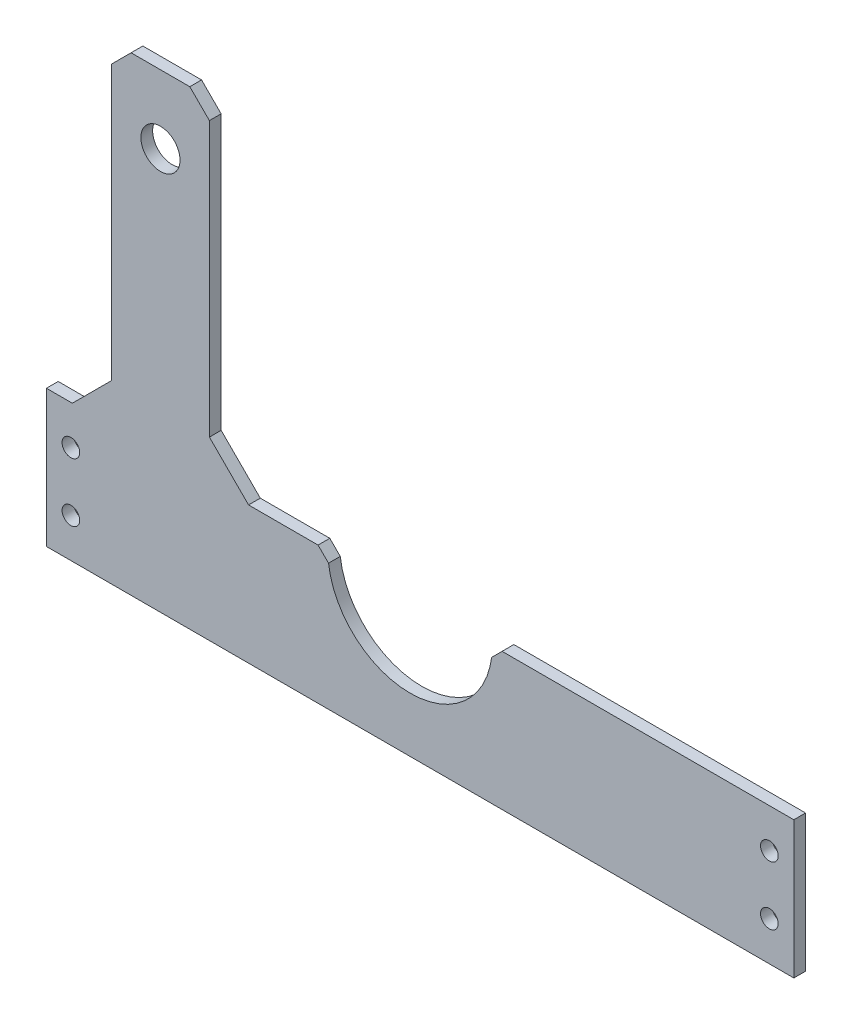
ISO-10303-21;
HEADER;
FILE_DESCRIPTION(('STEP AP214'),'2;1');
FILE_NAME('part.step','',(''),(''),'','','');
FILE_SCHEMA(('AUTOMOTIVE_DESIGN { 1 0 10303 214 1 1 1 1 }'));
ENDSEC;
DATA;
#1=APPLICATION_CONTEXT('core data for automotive mechanical design processes');
#2=APPLICATION_PROTOCOL_DEFINITION('international standard','automotive_design',2000,#1);
#3=PRODUCT_CONTEXT('',#1,'mechanical');
#4=PRODUCT('Part','Part','',(#3));
#5=PRODUCT_RELATED_PRODUCT_CATEGORY('part','',(#4));
#6=PRODUCT_DEFINITION_FORMATION('','',#4);
#7=PRODUCT_DEFINITION_CONTEXT('part definition',#1,'design');
#8=PRODUCT_DEFINITION('design','',#6,#7);
#9=PRODUCT_DEFINITION_SHAPE('','',#8);
#10=(LENGTH_UNIT() NAMED_UNIT(*) SI_UNIT(.MILLI.,.METRE.));
#11=(NAMED_UNIT(*) PLANE_ANGLE_UNIT() SI_UNIT($,.RADIAN.));
#12=(NAMED_UNIT(*) SI_UNIT($,.STERADIAN.) SOLID_ANGLE_UNIT());
#13=UNCERTAINTY_MEASURE_WITH_UNIT(LENGTH_MEASURE(1.E-05),#10,'distance_accuracy_value','');
#14=(GEOMETRIC_REPRESENTATION_CONTEXT(3) GLOBAL_UNCERTAINTY_ASSIGNED_CONTEXT((#13)) GLOBAL_UNIT_ASSIGNED_CONTEXT((#10,
#11,#12)) REPRESENTATION_CONTEXT('',''));
#15=CARTESIAN_POINT('',(0.,0.,0.));
#16=DIRECTION('',(0.,0.,1.));
#17=DIRECTION('',(1.,0.,0.));
#18=AXIS2_PLACEMENT_3D('',#15,#16,#17);
#19=CARTESIAN_POINT('',(-95.435,17.5,1.5));
#20=DIRECTION('',(0.,-1.,0.));
#21=DIRECTION('',(0.,0.,-1.));
#22=AXIS2_PLACEMENT_3D('',#19,#20,#21);
#23=PLANE('',#22);
#24=DIRECTION('',(-1.,0.,0.));
#25=VECTOR('',#24,1.);
#26=CARTESIAN_POINT('',(-95.435,17.5,1.5));
#27=LINE('',#26,#25);
#28=CARTESIAN_POINT('',(-26.065,17.5,1.5));
#29=VERTEX_POINT('',#28);
#30=CARTESIAN_POINT('',(-43.815,17.5,1.5));
#31=VERTEX_POINT('',#30);
#32=EDGE_CURVE('E233',#29,#31,#27,.T.);
#33=ORIENTED_EDGE('',*,*,#32,.F.);
#34=DIRECTION('',(0.,0.,-1.));
#35=VECTOR('',#34,1.);
#36=CARTESIAN_POINT('',(-26.065,17.5,1.5));
#37=LINE('',#36,#35);
#38=CARTESIAN_POINT('',(-26.065,17.5,-1.5));
#39=VERTEX_POINT('',#38);
#40=EDGE_CURVE('E220',#29,#39,#37,.T.);
#41=ORIENTED_EDGE('',*,*,#40,.T.);
#42=DIRECTION('',(-1.,0.,0.));
#43=VECTOR('',#42,1.);
#44=CARTESIAN_POINT('',(-95.435,17.5,-1.5));
#45=LINE('',#44,#43);
#46=CARTESIAN_POINT('',(-43.815,17.5,-1.5));
#47=VERTEX_POINT('',#46);
#48=EDGE_CURVE('E249',#39,#47,#45,.T.);
#49=ORIENTED_EDGE('',*,*,#48,.T.);
#50=DIRECTION('',(0.,0.,1.));
#51=VECTOR('',#50,1.);
#52=CARTESIAN_POINT('',(-43.815,17.5,1.5));
#53=LINE('',#52,#51);
#54=EDGE_CURVE('E208',#47,#31,#53,.T.);
#55=ORIENTED_EDGE('',*,*,#54,.T.);
#56=EDGE_LOOP('',(#33,#41,#49,#55));
#57=FACE_BOUND('',#56,.T.);
#58=ADVANCED_FACE('F37',(#57),#23,.F.);
#59=CARTESIAN_POINT('',(-88.815,17.5,1.5));
#60=VERTEX_POINT('',#59);
#61=CARTESIAN_POINT('',(-95.435,17.5,1.5));
#62=VERTEX_POINT('',#61);
#63=EDGE_CURVE('E165',#60,#62,#27,.T.);
#64=ORIENTED_EDGE('',*,*,#63,.F.);
#65=DIRECTION('',(0.,0.,-1.));
#66=VECTOR('',#65,1.);
#67=CARTESIAN_POINT('',(-88.815,17.5,-1.49999999999995));
#68=LINE('',#67,#66);
#69=CARTESIAN_POINT('',(-88.815,17.5,-1.5));
#70=VERTEX_POINT('',#69);
#71=EDGE_CURVE('E203',#60,#70,#68,.T.);
#72=ORIENTED_EDGE('',*,*,#71,.T.);
#73=CARTESIAN_POINT('',(-95.435,17.5,-1.5));
#74=VERTEX_POINT('',#73);
#75=EDGE_CURVE('E261',#70,#74,#45,.T.);
#76=ORIENTED_EDGE('',*,*,#75,.T.);
#77=DIRECTION('',(0.,0.,-1.));
#78=VECTOR('',#77,1.);
#79=CARTESIAN_POINT('',(-95.435,17.5,1.5));
#80=LINE('',#79,#78);
#81=EDGE_CURVE('E272',#62,#74,#80,.T.);
#82=ORIENTED_EDGE('',*,*,#81,.F.);
#83=EDGE_LOOP('',(#64,#72,#76,#82));
#84=FACE_BOUND('',#83,.T.);
#85=ADVANCED_FACE('F356',(#84),#23,.F.);
#86=CARTESIAN_POINT('',(95.435,17.5,-1.5));
#87=VERTEX_POINT('',#86);
#88=CARTESIAN_POINT('',(20.935,17.5,-1.5));
#89=VERTEX_POINT('',#88);
#90=EDGE_CURVE('E169',#87,#89,#45,.T.);
#91=ORIENTED_EDGE('',*,*,#90,.T.);
#92=DIRECTION('',(0.,0.,1.));
#93=VECTOR('',#92,1.);
#94=CARTESIAN_POINT('',(20.935,17.5,1.5));
#95=LINE('',#94,#93);
#96=CARTESIAN_POINT('',(20.935,17.5,1.5));
#97=VERTEX_POINT('',#96);
#98=EDGE_CURVE('E11',#89,#97,#95,.T.);
#99=ORIENTED_EDGE('',*,*,#98,.T.);
#100=CARTESIAN_POINT('',(95.435,17.5,1.5));
#101=VERTEX_POINT('',#100);
#102=EDGE_CURVE('E242',#101,#97,#27,.T.);
#103=ORIENTED_EDGE('',*,*,#102,.F.);
#104=DIRECTION('',(0.,0.,-1.));
#105=VECTOR('',#104,1.);
#106=CARTESIAN_POINT('',(95.435,17.5,1.5));
#107=LINE('',#106,#105);
#108=EDGE_CURVE('E179',#101,#87,#107,.T.);
#109=ORIENTED_EDGE('',*,*,#108,.T.);
#110=EDGE_LOOP('',(#91,#99,#103,#109));
#111=FACE_BOUND('',#110,.T.);
#112=ADVANCED_FACE('F257',(#111),#23,.F.);
#113=CARTESIAN_POINT('',(-95.435,-17.5,1.5));
#114=DIRECTION('',(1.,0.,0.));
#115=DIRECTION('',(0.,0.,-1.));
#116=AXIS2_PLACEMENT_3D('',#113,#114,#115);
#117=PLANE('',#116);
#118=DIRECTION('',(0.,-1.,0.));
#119=VECTOR('',#118,1.);
#120=CARTESIAN_POINT('',(-95.435,-17.5,-1.5));
#121=LINE('',#120,#119);
#122=CARTESIAN_POINT('',(-95.435,-17.5,-1.5));
#123=VERTEX_POINT('',#122);
#124=EDGE_CURVE('E173',#74,#123,#121,.T.);
#125=ORIENTED_EDGE('',*,*,#124,.T.);
#126=DIRECTION('',(0.,0.,-1.));
#127=VECTOR('',#126,1.);
#128=CARTESIAN_POINT('',(-95.435,-17.5,1.5));
#129=LINE('',#128,#127);
#130=CARTESIAN_POINT('',(-95.435,-17.5,1.5));
#131=VERTEX_POINT('',#130);
#132=EDGE_CURVE('E154',#131,#123,#129,.T.);
#133=ORIENTED_EDGE('',*,*,#132,.F.);
#134=DIRECTION('',(0.,-1.,0.));
#135=VECTOR('',#134,1.);
#136=CARTESIAN_POINT('',(-95.435,-17.5,1.5));
#137=LINE('',#136,#135);
#138=EDGE_CURVE('E160',#62,#131,#137,.T.);
#139=ORIENTED_EDGE('',*,*,#138,.F.);
#140=ORIENTED_EDGE('',*,*,#81,.T.);
#141=EDGE_LOOP('',(#125,#133,#139,#140));
#142=FACE_BOUND('',#141,.T.);
#143=ADVANCED_FACE('F171',(#142),#117,.F.);
#144=CARTESIAN_POINT('',(-95.435,-17.5,1.5));
#145=DIRECTION('',(0.,1.,0.));
#146=DIRECTION('',(0.,0.,1.));
#147=AXIS2_PLACEMENT_3D('',#144,#145,#146);
#148=PLANE('',#147);
#149=DIRECTION('',(1.,0.,0.));
#150=VECTOR('',#149,1.);
#151=CARTESIAN_POINT('',(-95.435,-17.5,-1.5));
#152=LINE('',#151,#150);
#153=CARTESIAN_POINT('',(95.435,-17.5,-1.5));
#154=VERTEX_POINT('',#153);
#155=EDGE_CURVE('E267',#123,#154,#152,.T.);
#156=ORIENTED_EDGE('',*,*,#155,.T.);
#157=DIRECTION('',(0.,0.,-1.));
#158=VECTOR('',#157,1.);
#159=CARTESIAN_POINT('',(95.435,-17.5,1.5));
#160=LINE('',#159,#158);
#161=CARTESIAN_POINT('',(95.435,-17.5,1.5));
#162=VERTEX_POINT('',#161);
#163=EDGE_CURVE('E157',#162,#154,#160,.T.);
#164=ORIENTED_EDGE('',*,*,#163,.F.);
#165=DIRECTION('',(1.,0.,0.));
#166=VECTOR('',#165,1.);
#167=CARTESIAN_POINT('',(-95.435,-17.5,1.5));
#168=LINE('',#167,#166);
#169=EDGE_CURVE('E150',#131,#162,#168,.T.);
#170=ORIENTED_EDGE('',*,*,#169,.F.);
#171=ORIENTED_EDGE('',*,*,#132,.T.);
#172=EDGE_LOOP('',(#156,#164,#170,#171));
#173=FACE_BOUND('',#172,.T.);
#174=ADVANCED_FACE('F152',(#173),#148,.F.);
#175=CARTESIAN_POINT('',(95.435,-17.5,1.5));
#176=DIRECTION('',(-1.,0.,0.));
#177=DIRECTION('',(0.,0.,1.));
#178=AXIS2_PLACEMENT_3D('',#175,#176,#177);
#179=PLANE('',#178);
#180=DIRECTION('',(0.,1.,0.));
#181=VECTOR('',#180,1.);
#182=CARTESIAN_POINT('',(95.435,-17.5,-1.5));
#183=LINE('',#182,#181);
#184=EDGE_CURVE('E264',#154,#87,#183,.T.);
#185=ORIENTED_EDGE('',*,*,#184,.T.);
#186=ORIENTED_EDGE('',*,*,#108,.F.);
#187=DIRECTION('',(0.,1.,0.));
#188=VECTOR('',#187,1.);
#189=CARTESIAN_POINT('',(95.435,-17.5,1.5));
#190=LINE('',#189,#188);
#191=EDGE_CURVE('E159',#162,#101,#190,.T.);
#192=ORIENTED_EDGE('',*,*,#191,.F.);
#193=ORIENTED_EDGE('',*,*,#163,.T.);
#194=EDGE_LOOP('',(#185,#186,#192,#193));
#195=FACE_BOUND('',#194,.T.);
#196=ADVANCED_FACE('F346',(#195),#179,.F.);
#197=CARTESIAN_POINT('',(0.,0.,1.5));
#198=DIRECTION('',(0.,0.,-1.));
#199=DIRECTION('',(-1.,0.,0.));
#200=AXIS2_PLACEMENT_3D('',#197,#198,#199);
#201=PLANE('',#200);
#202=CARTESIAN_POINT('',(89.185,7.49999999999998,1.5));
#203=DIRECTION('',(0.,0.,-1.));
#204=DIRECTION('',(-1.,0.,0.));
#205=AXIS2_PLACEMENT_3D('',#202,#203,#204);
#206=CIRCLE('',#205,2.25);
#207=CARTESIAN_POINT('',(86.935,7.49999999999998,1.5));
#208=VERTEX_POINT('',#207);
#209=EDGE_CURVE('E317',#208,#208,#206,.T.);
#210=ORIENTED_EDGE('',*,*,#209,.T.);
#211=EDGE_LOOP('',(#210));
#212=FACE_BOUND('',#211,.T.);
#213=CARTESIAN_POINT('',(89.185,-7.50000000000001,1.5));
#214=DIRECTION('',(0.,0.,-1.));
#215=DIRECTION('',(-1.,0.,0.));
#216=AXIS2_PLACEMENT_3D('',#213,#214,#215);
#217=CIRCLE('',#216,2.25);
#218=CARTESIAN_POINT('',(86.935,-7.50000000000001,1.5));
#219=VERTEX_POINT('',#218);
#220=EDGE_CURVE('E311',#219,#219,#217,.T.);
#221=ORIENTED_EDGE('',*,*,#220,.T.);
#222=EDGE_LOOP('',(#221));
#223=FACE_BOUND('',#222,.T.);
#224=CARTESIAN_POINT('',(-89.1900000000001,7.49999999999997,1.5));
#225=DIRECTION('',(0.,0.,-1.));
#226=DIRECTION('',(-1.,0.,0.));
#227=AXIS2_PLACEMENT_3D('',#224,#225,#226);
#228=CIRCLE('',#227,2.25);
#229=CARTESIAN_POINT('',(-91.4400000000001,7.49999999999997,1.5));
#230=VERTEX_POINT('',#229);
#231=EDGE_CURVE('E305',#230,#230,#228,.T.);
#232=ORIENTED_EDGE('',*,*,#231,.T.);
#233=EDGE_LOOP('',(#232));
#234=FACE_BOUND('',#233,.T.);
#235=CARTESIAN_POINT('',(-89.1900000000001,-7.50000000000002,1.5));
#236=DIRECTION('',(0.,0.,-1.));
#237=DIRECTION('',(-1.,0.,0.));
#238=AXIS2_PLACEMENT_3D('',#235,#236,#237);
#239=CIRCLE('',#238,2.25);
#240=CARTESIAN_POINT('',(-91.4400000000001,-7.50000000000002,1.5));
#241=VERTEX_POINT('',#240);
#242=EDGE_CURVE('E297',#241,#241,#239,.T.);
#243=ORIENTED_EDGE('',*,*,#242,.T.);
#244=EDGE_LOOP('',(#243));
#245=FACE_BOUND('',#244,.T.);
#246=CARTESIAN_POINT('',(-66.315,85.,1.5));
#247=DIRECTION('',(0.,0.,1.));
#248=DIRECTION('',(1.,0.,0.));
#249=AXIS2_PLACEMENT_3D('',#246,#247,#248);
#250=CIRCLE('',#249,5.00000000000001);
#251=CARTESIAN_POINT('',(-61.315,85.,1.5));
#252=VERTEX_POINT('',#251);
#253=EDGE_CURVE('E293',#252,#252,#250,.T.);
#254=ORIENTED_EDGE('',*,*,#253,.F.);
#255=EDGE_LOOP('',(#254));
#256=FACE_BOUND('',#255,.T.);
#257=CARTESIAN_POINT('',(-2.565,17.5,1.5));
#258=DIRECTION('',(0.,0.,1.));
#259=DIRECTION('',(1.,0.,0.));
#260=AXIS2_PLACEMENT_3D('',#257,#258,#259);
#261=CIRCLE('',#260,21.);
#262=CARTESIAN_POINT('',(-23.3945098986674,14.8295098986675,1.5));
#263=VERTEX_POINT('',#262);
#264=CARTESIAN_POINT('',(18.2645098986674,14.8295098986674,1.5));
#265=VERTEX_POINT('',#264);
#266=EDGE_CURVE('E234',#263,#265,#261,.T.);
#267=ORIENTED_EDGE('',*,*,#266,.F.);
#268=DIRECTION('',(-0.707106781186547,0.707106781186548,0.));
#269=VECTOR('',#268,1.);
#270=CARTESIAN_POINT('',(-26.065,17.5,1.5));
#271=LINE('',#270,#269);
#272=EDGE_CURVE('E45',#263,#29,#271,.T.);
#273=ORIENTED_EDGE('',*,*,#272,.T.);
#274=ORIENTED_EDGE('',*,*,#32,.T.);
#275=DIRECTION('',(0.707106781186545,-0.70710678118655,0.));
#276=VECTOR('',#275,1.);
#277=CARTESIAN_POINT('',(-13.1575000000002,-13.1575000000001,1.5));
#278=LINE('',#277,#276);
#279=CARTESIAN_POINT('',(-53.815,27.5000000000001,1.5));
#280=VERTEX_POINT('',#279);
#281=EDGE_CURVE('E218',#31,#280,#278,.F.);
#282=ORIENTED_EDGE('',*,*,#281,.T.);
#283=DIRECTION('',(0.,-1.,0.));
#284=VECTOR('',#283,1.);
#285=CARTESIAN_POINT('',(-53.815,102.5,1.5));
#286=LINE('',#285,#284);
#287=CARTESIAN_POINT('',(-53.815,97.5,1.5));
#288=VERTEX_POINT('',#287);
#289=EDGE_CURVE('E284',#288,#280,#286,.T.);
#290=ORIENTED_EDGE('',*,*,#289,.F.);
#291=DIRECTION('',(-0.707106781186546,0.707106781186549,0.));
#292=VECTOR('',#291,1.);
#293=CARTESIAN_POINT('',(-58.815,102.5,1.5));
#294=LINE('',#293,#292);
#295=CARTESIAN_POINT('',(-58.815,102.5,1.5));
#296=VERTEX_POINT('',#295);
#297=EDGE_CURVE('E188',#288,#296,#294,.T.);
#298=ORIENTED_EDGE('',*,*,#297,.T.);
#299=DIRECTION('',(1.,0.,0.));
#300=VECTOR('',#299,1.);
#301=CARTESIAN_POINT('',(-53.815,102.5,1.5));
#302=LINE('',#301,#300);
#303=CARTESIAN_POINT('',(-73.815,102.5,1.5));
#304=VERTEX_POINT('',#303);
#305=EDGE_CURVE('E287',#304,#296,#302,.T.);
#306=ORIENTED_EDGE('',*,*,#305,.F.);
#307=DIRECTION('',(-0.707106781186548,-0.707106781186547,0.));
#308=VECTOR('',#307,1.);
#309=CARTESIAN_POINT('',(-73.815,102.5,1.5));
#310=LINE('',#309,#308);
#311=CARTESIAN_POINT('',(-78.815,97.5,1.5));
#312=VERTEX_POINT('',#311);
#313=EDGE_CURVE('E190',#304,#312,#310,.T.);
#314=ORIENTED_EDGE('',*,*,#313,.T.);
#315=DIRECTION('',(0.,-1.,0.));
#316=VECTOR('',#315,1.);
#317=CARTESIAN_POINT('',(-78.815,102.5,1.5));
#318=LINE('',#317,#316);
#319=CARTESIAN_POINT('',(-78.815,27.5000000000001,1.5));
#320=VERTEX_POINT('',#319);
#321=EDGE_CURVE('E281',#312,#320,#318,.T.);
#322=ORIENTED_EDGE('',*,*,#321,.T.);
#323=DIRECTION('',(0.707106781186545,0.70710678118655,0.));
#324=VECTOR('',#323,1.);
#325=CARTESIAN_POINT('',(-53.1575000000004,53.1574999999999,1.5));
#326=LINE('',#325,#324);
#327=EDGE_CURVE('E211',#320,#60,#326,.F.);
#328=ORIENTED_EDGE('',*,*,#327,.T.);
#329=ORIENTED_EDGE('',*,*,#63,.T.);
#330=ORIENTED_EDGE('',*,*,#138,.T.);
#331=ORIENTED_EDGE('',*,*,#169,.T.);
#332=ORIENTED_EDGE('',*,*,#191,.T.);
#333=ORIENTED_EDGE('',*,*,#102,.T.);
#334=DIRECTION('',(0.707106781186546,0.707106781186549,0.));
#335=VECTOR('',#334,1.);
#336=CARTESIAN_POINT('',(20.935,17.5,1.5));
#337=LINE('',#336,#335);
#338=EDGE_CURVE('E52',#97,#265,#337,.F.);
#339=ORIENTED_EDGE('',*,*,#338,.T.);
#340=EDGE_LOOP('',(#267,#273,#274,#282,#290,#298,#306,#314,#322,#328,#329,#330,#331,#332,#333,#339));
#341=FACE_BOUND('',#340,.T.);
#342=ADVANCED_FACE('F163',(#212,#223,#234,#245,#256,#341),#201,.F.);
#343=CARTESIAN_POINT('',(0.,0.,-1.5));
#344=DIRECTION('',(0.,0.,-1.));
#345=DIRECTION('',(-1.,0.,0.));
#346=AXIS2_PLACEMENT_3D('',#343,#344,#345);
#347=PLANE('',#346);
#348=CARTESIAN_POINT('',(89.185,7.49999999999998,-1.5));
#349=DIRECTION('',(0.,0.,-1.));
#350=DIRECTION('',(-1.,0.,0.));
#351=AXIS2_PLACEMENT_3D('',#348,#349,#350);
#352=CIRCLE('',#351,2.24999999999999);
#353=CARTESIAN_POINT('',(86.935,7.49999999999998,-1.5));
#354=VERTEX_POINT('',#353);
#355=EDGE_CURVE('E320',#354,#354,#352,.T.);
#356=ORIENTED_EDGE('',*,*,#355,.F.);
#357=EDGE_LOOP('',(#356));
#358=FACE_BOUND('',#357,.T.);
#359=CARTESIAN_POINT('',(89.185,-7.50000000000001,-1.5));
#360=DIRECTION('',(0.,0.,-1.));
#361=DIRECTION('',(-1.,0.,0.));
#362=AXIS2_PLACEMENT_3D('',#359,#360,#361);
#363=CIRCLE('',#362,2.24999999999999);
#364=CARTESIAN_POINT('',(86.935,-7.50000000000001,-1.5));
#365=VERTEX_POINT('',#364);
#366=EDGE_CURVE('E314',#365,#365,#363,.T.);
#367=ORIENTED_EDGE('',*,*,#366,.F.);
#368=EDGE_LOOP('',(#367));
#369=FACE_BOUND('',#368,.T.);
#370=CARTESIAN_POINT('',(-89.1900000000001,7.49999999999997,-1.5));
#371=DIRECTION('',(0.,0.,-1.));
#372=DIRECTION('',(-1.,0.,0.));
#373=AXIS2_PLACEMENT_3D('',#370,#371,#372);
#374=CIRCLE('',#373,2.24999999999999);
#375=CARTESIAN_POINT('',(-91.4400000000001,7.49999999999997,-1.5));
#376=VERTEX_POINT('',#375);
#377=EDGE_CURVE('E308',#376,#376,#374,.T.);
#378=ORIENTED_EDGE('',*,*,#377,.F.);
#379=EDGE_LOOP('',(#378));
#380=FACE_BOUND('',#379,.T.);
#381=CARTESIAN_POINT('',(-89.1900000000001,-7.50000000000002,-1.5));
#382=DIRECTION('',(0.,0.,-1.));
#383=DIRECTION('',(-1.,0.,0.));
#384=AXIS2_PLACEMENT_3D('',#381,#382,#383);
#385=CIRCLE('',#384,2.24999999999999);
#386=CARTESIAN_POINT('',(-91.4400000000001,-7.50000000000002,-1.5));
#387=VERTEX_POINT('',#386);
#388=EDGE_CURVE('E302',#387,#387,#385,.T.);
#389=ORIENTED_EDGE('',*,*,#388,.F.);
#390=EDGE_LOOP('',(#389));
#391=FACE_BOUND('',#390,.T.);
#392=CARTESIAN_POINT('',(-66.315,85.,-1.5));
#393=DIRECTION('',(0.,0.,-1.));
#394=DIRECTION('',(-1.,0.,0.));
#395=AXIS2_PLACEMENT_3D('',#392,#393,#394);
#396=CIRCLE('',#395,5.00000000000001);
#397=CARTESIAN_POINT('',(-61.315,85.,-1.5));
#398=VERTEX_POINT('',#397);
#399=EDGE_CURVE('E294',#398,#398,#396,.F.);
#400=ORIENTED_EDGE('',*,*,#399,.T.);
#401=EDGE_LOOP('',(#400));
#402=FACE_BOUND('',#401,.T.);
#403=ORIENTED_EDGE('',*,*,#48,.F.);
#404=DIRECTION('',(0.707106781186547,-0.707106781186548,0.));
#405=VECTOR('',#404,1.);
#406=CARTESIAN_POINT('',(-4.28250000000002,-4.28250000000001,-1.5));
#407=LINE('',#406,#405);
#408=CARTESIAN_POINT('',(-23.3945098986674,14.8295098986675,-1.5));
#409=VERTEX_POINT('',#408);
#410=EDGE_CURVE('E225',#39,#409,#407,.T.);
#411=ORIENTED_EDGE('',*,*,#410,.T.);
#412=CARTESIAN_POINT('',(-2.565,17.5,-1.5));
#413=DIRECTION('',(0.,0.,-1.));
#414=DIRECTION('',(-1.,0.,0.));
#415=AXIS2_PLACEMENT_3D('',#412,#413,#414);
#416=CIRCLE('',#415,21.);
#417=CARTESIAN_POINT('',(18.2645098986674,14.8295098986674,-1.5));
#418=VERTEX_POINT('',#417);
#419=EDGE_CURVE('E174',#418,#409,#416,.T.);
#420=ORIENTED_EDGE('',*,*,#419,.F.);
#421=DIRECTION('',(-0.707106781186546,-0.707106781186549,0.));
#422=VECTOR('',#421,1.);
#423=CARTESIAN_POINT('',(1.71750000000003,-1.71750000000003,-1.5));
#424=LINE('',#423,#422);
#425=EDGE_CURVE('E223',#418,#89,#424,.F.);
#426=ORIENTED_EDGE('',*,*,#425,.T.);
#427=ORIENTED_EDGE('',*,*,#90,.F.);
#428=ORIENTED_EDGE('',*,*,#184,.F.);
#429=ORIENTED_EDGE('',*,*,#155,.F.);
#430=ORIENTED_EDGE('',*,*,#124,.F.);
#431=ORIENTED_EDGE('',*,*,#75,.F.);
#432=DIRECTION('',(-0.707106781186545,-0.70710678118655,0.));
#433=VECTOR('',#432,1.);
#434=CARTESIAN_POINT('',(-78.815,27.5000000000001,-1.5));
#435=LINE('',#434,#433);
#436=CARTESIAN_POINT('',(-78.815,27.5000000000001,-1.5));
#437=VERTEX_POINT('',#436);
#438=EDGE_CURVE('E213',#70,#437,#435,.F.);
#439=ORIENTED_EDGE('',*,*,#438,.T.);
#440=DIRECTION('',(0.,-1.,0.));
#441=VECTOR('',#440,1.);
#442=CARTESIAN_POINT('',(-78.815,102.5,-1.5));
#443=LINE('',#442,#441);
#444=CARTESIAN_POINT('',(-78.815,97.5,-1.5));
#445=VERTEX_POINT('',#444);
#446=EDGE_CURVE('E278',#445,#437,#443,.T.);
#447=ORIENTED_EDGE('',*,*,#446,.F.);
#448=DIRECTION('',(0.707106781186548,0.707106781186547,0.));
#449=VECTOR('',#448,1.);
#450=CARTESIAN_POINT('',(-88.1574999999999,88.1575000000001,-1.5));
#451=LINE('',#450,#449);
#452=CARTESIAN_POINT('',(-73.815,102.5,-1.5));
#453=VERTEX_POINT('',#452);
#454=EDGE_CURVE('E196',#445,#453,#451,.T.);
#455=ORIENTED_EDGE('',*,*,#454,.T.);
#456=DIRECTION('',(-1.,0.,0.));
#457=VECTOR('',#456,1.);
#458=CARTESIAN_POINT('',(-53.815,102.5,-1.5));
#459=LINE('',#458,#457);
#460=CARTESIAN_POINT('',(-58.815,102.5,-1.5));
#461=VERTEX_POINT('',#460);
#462=EDGE_CURVE('E290',#461,#453,#459,.T.);
#463=ORIENTED_EDGE('',*,*,#462,.F.);
#464=DIRECTION('',(0.707106781186546,-0.707106781186549,0.));
#465=VECTOR('',#464,1.);
#466=CARTESIAN_POINT('',(21.8424999999998,21.8424999999997,-1.5));
#467=LINE('',#466,#465);
#468=CARTESIAN_POINT('',(-53.815,97.5,-1.5));
#469=VERTEX_POINT('',#468);
#470=EDGE_CURVE('E194',#461,#469,#467,.T.);
#471=ORIENTED_EDGE('',*,*,#470,.T.);
#472=DIRECTION('',(0.,-1.,0.));
#473=VECTOR('',#472,1.);
#474=CARTESIAN_POINT('',(-53.815,102.5,-1.5));
#475=LINE('',#474,#473);
#476=CARTESIAN_POINT('',(-53.815,27.5000000000001,-1.5));
#477=VERTEX_POINT('',#476);
#478=EDGE_CURVE('E275',#469,#477,#475,.T.);
#479=ORIENTED_EDGE('',*,*,#478,.T.);
#480=DIRECTION('',(-0.707106781186545,0.70710678118655,0.));
#481=VECTOR('',#480,1.);
#482=CARTESIAN_POINT('',(-53.815,27.5000000000001,-1.5));
#483=LINE('',#482,#481);
#484=EDGE_CURVE('E215',#477,#47,#483,.F.);
#485=ORIENTED_EDGE('',*,*,#484,.T.);
#486=EDGE_LOOP('',(#403,#411,#420,#426,#427,#428,#429,#430,#431,#439,#447,#455,#463,#471,#479,#485));
#487=FACE_BOUND('',#486,.T.);
#488=ADVANCED_FACE('F247',(#358,#369,#380,#391,#402,#487),#347,.T.);
#489=CARTESIAN_POINT('',(-2.565,17.5,-1.5));
#490=DIRECTION('',(0.,0.,1.));
#491=DIRECTION('',(1.,0.,0.));
#492=AXIS2_PLACEMENT_3D('',#489,#490,#491);
#493=CYLINDRICAL_SURFACE('',#492,21.);
#494=ORIENTED_EDGE('',*,*,#419,.T.);
#495=DIRECTION('',(0.,0.,1.));
#496=VECTOR('',#495,1.);
#497=CARTESIAN_POINT('',(-23.3945098986674,14.8295098986675,-1.5));
#498=LINE('',#497,#496);
#499=EDGE_CURVE('E229',#409,#263,#498,.T.);
#500=ORIENTED_EDGE('',*,*,#499,.T.);
#501=ORIENTED_EDGE('',*,*,#266,.T.);
#502=DIRECTION('',(0.,0.,1.));
#503=VECTOR('',#502,1.);
#504=CARTESIAN_POINT('',(18.2645098986674,14.8295098986674,-1.5));
#505=LINE('',#504,#503);
#506=EDGE_CURVE('E227',#265,#418,#505,.F.);
#507=ORIENTED_EDGE('',*,*,#506,.T.);
#508=EDGE_LOOP('',(#494,#500,#501,#507));
#509=FACE_BOUND('',#508,.T.);
#510=ADVANCED_FACE('F251',(#509),#493,.F.);
#511=CARTESIAN_POINT('',(-53.815,102.5,1.5));
#512=DIRECTION('',(-1.,0.,0.));
#513=DIRECTION('',(0.,0.,1.));
#514=AXIS2_PLACEMENT_3D('',#511,#512,#513);
#515=PLANE('',#514);
#516=ORIENTED_EDGE('',*,*,#289,.T.);
#517=DIRECTION('',(0.,0.,-1.));
#518=VECTOR('',#517,1.);
#519=CARTESIAN_POINT('',(-53.815,27.5000000000001,-1.5));
#520=LINE('',#519,#518);
#521=EDGE_CURVE('E205',#280,#477,#520,.T.);
#522=ORIENTED_EDGE('',*,*,#521,.T.);
#523=ORIENTED_EDGE('',*,*,#478,.F.);
#524=DIRECTION('',(0.,0.,1.));
#525=VECTOR('',#524,1.);
#526=CARTESIAN_POINT('',(-53.815,97.5,1.5));
#527=LINE('',#526,#525);
#528=EDGE_CURVE('E198',#469,#288,#527,.T.);
#529=ORIENTED_EDGE('',*,*,#528,.T.);
#530=EDGE_LOOP('',(#516,#522,#523,#529));
#531=FACE_BOUND('',#530,.T.);
#532=ADVANCED_FACE('F414',(#531),#515,.F.);
#533=CARTESIAN_POINT('',(-78.815,102.5,1.5));
#534=DIRECTION('',(1.,0.,0.));
#535=DIRECTION('',(0.,0.,-1.));
#536=AXIS2_PLACEMENT_3D('',#533,#534,#535);
#537=PLANE('',#536);
#538=ORIENTED_EDGE('',*,*,#446,.T.);
#539=DIRECTION('',(0.,0.,1.));
#540=VECTOR('',#539,1.);
#541=CARTESIAN_POINT('',(-78.815,27.5000000000001,1.5));
#542=LINE('',#541,#540);
#543=EDGE_CURVE('E200',#437,#320,#542,.T.);
#544=ORIENTED_EDGE('',*,*,#543,.T.);
#545=ORIENTED_EDGE('',*,*,#321,.F.);
#546=DIRECTION('',(0.,0.,-1.));
#547=VECTOR('',#546,1.);
#548=CARTESIAN_POINT('',(-78.815,97.5,-1.5));
#549=LINE('',#548,#547);
#550=EDGE_CURVE('E192',#312,#445,#549,.T.);
#551=ORIENTED_EDGE('',*,*,#550,.T.);
#552=EDGE_LOOP('',(#538,#544,#545,#551));
#553=FACE_BOUND('',#552,.T.);
#554=ADVANCED_FACE('F410',(#553),#537,.F.);
#555=CARTESIAN_POINT('',(0.,102.5,0.));
#556=DIRECTION('',(0.,1.,0.));
#557=DIRECTION('',(0.,0.,1.));
#558=AXIS2_PLACEMENT_3D('',#555,#556,#557);
#559=PLANE('',#558);
#560=ORIENTED_EDGE('',*,*,#462,.T.);
#561=DIRECTION('',(0.,0.,1.));
#562=VECTOR('',#561,1.);
#563=CARTESIAN_POINT('',(-73.815,102.5,1.49999999999998));
#564=LINE('',#563,#562);
#565=EDGE_CURVE('E185',#453,#304,#564,.T.);
#566=ORIENTED_EDGE('',*,*,#565,.T.);
#567=ORIENTED_EDGE('',*,*,#305,.T.);
#568=DIRECTION('',(0.,0.,-1.));
#569=VECTOR('',#568,1.);
#570=CARTESIAN_POINT('',(-58.815,102.5,-1.5));
#571=LINE('',#570,#569);
#572=EDGE_CURVE('E177',#296,#461,#571,.T.);
#573=ORIENTED_EDGE('',*,*,#572,.T.);
#574=EDGE_LOOP('',(#560,#566,#567,#573));
#575=FACE_BOUND('',#574,.T.);
#576=ADVANCED_FACE('F374',(#575),#559,.T.);
#577=CARTESIAN_POINT('',(-73.815,102.5,3.41462969011275E-13));
#578=DIRECTION('',(-0.707106781186547,0.707106781186548,0.));
#579=DIRECTION('',(0.,0.,-1.));
#580=AXIS2_PLACEMENT_3D('',#577,#578,#579);
#581=PLANE('',#580);
#582=ORIENTED_EDGE('',*,*,#454,.F.);
#583=ORIENTED_EDGE('',*,*,#550,.F.);
#584=ORIENTED_EDGE('',*,*,#313,.F.);
#585=ORIENTED_EDGE('',*,*,#565,.F.);
#586=EDGE_LOOP('',(#582,#583,#584,#585));
#587=FACE_BOUND('',#586,.T.);
#588=ADVANCED_FACE('F371',(#587),#581,.T.);
#589=CARTESIAN_POINT('',(-58.815,102.5,0.));
#590=DIRECTION('',(0.707106781186549,0.707106781186545,0.));
#591=DIRECTION('',(0.,0.,1.));
#592=AXIS2_PLACEMENT_3D('',#589,#590,#591);
#593=PLANE('',#592);
#594=ORIENTED_EDGE('',*,*,#297,.F.);
#595=ORIENTED_EDGE('',*,*,#528,.F.);
#596=ORIENTED_EDGE('',*,*,#470,.F.);
#597=ORIENTED_EDGE('',*,*,#572,.F.);
#598=EDGE_LOOP('',(#594,#595,#596,#597));
#599=FACE_BOUND('',#598,.T.);
#600=ADVANCED_FACE('F341',(#599),#593,.T.);
#601=CARTESIAN_POINT('',(-66.315,85.,-1.501));
#602=DIRECTION('',(0.,0.,1.));
#603=DIRECTION('',(1.,0.,0.));
#604=AXIS2_PLACEMENT_3D('',#601,#602,#603);
#605=CYLINDRICAL_SURFACE('',#604,5.00000000000001);
#606=CARTESIAN_POINT('',(-61.315,85.,-1.5));
#607=CARTESIAN_POINT('',(-61.315,85.,-1.46875));
#608=CARTESIAN_POINT('',(-61.315,85.,-1.4375));
#609=CARTESIAN_POINT('',(-61.315,85.,-1.375));
#610=CARTESIAN_POINT('',(-61.315,85.,-1.34375));
#611=CARTESIAN_POINT('',(-61.315,85.,-1.28125));
#612=CARTESIAN_POINT('',(-61.315,85.,-1.25));
#613=CARTESIAN_POINT('',(-61.315,85.,-1.1875));
#614=CARTESIAN_POINT('',(-61.315,85.,-1.15625));
#615=CARTESIAN_POINT('',(-61.315,85.,-1.09375));
#616=CARTESIAN_POINT('',(-61.315,85.,-1.0625));
#617=CARTESIAN_POINT('',(-61.315,85.,-1.));
#618=CARTESIAN_POINT('',(-61.315,85.,-0.96875));
#619=CARTESIAN_POINT('',(-61.315,85.,-0.90625));
#620=CARTESIAN_POINT('',(-61.315,85.,-0.875));
#621=CARTESIAN_POINT('',(-61.315,85.,-0.8125));
#622=CARTESIAN_POINT('',(-61.315,85.,-0.78125));
#623=CARTESIAN_POINT('',(-61.315,85.,-0.71875));
#624=CARTESIAN_POINT('',(-61.315,85.,-0.6875));
#625=CARTESIAN_POINT('',(-61.315,85.,-0.625));
#626=CARTESIAN_POINT('',(-61.315,85.,-0.59375));
#627=CARTESIAN_POINT('',(-61.315,85.,-0.53125));
#628=CARTESIAN_POINT('',(-61.315,85.,-0.5));
#629=CARTESIAN_POINT('',(-61.315,85.,-0.4375));
#630=CARTESIAN_POINT('',(-61.315,85.,-0.40625));
#631=CARTESIAN_POINT('',(-61.315,85.,-0.34375));
#632=CARTESIAN_POINT('',(-61.315,85.,-0.3125));
#633=CARTESIAN_POINT('',(-61.315,85.,-0.25));
#634=CARTESIAN_POINT('',(-61.315,85.,-0.21875));
#635=CARTESIAN_POINT('',(-61.315,85.,-0.15625));
#636=CARTESIAN_POINT('',(-61.315,85.,-0.125));
#637=CARTESIAN_POINT('',(-61.315,85.,-0.0625000000000001));
#638=CARTESIAN_POINT('',(-61.315,85.,-0.03125));
#639=CARTESIAN_POINT('',(-61.315,85.,0.03125));
#640=CARTESIAN_POINT('',(-61.315,85.,0.0625000000000001));
#641=CARTESIAN_POINT('',(-61.315,85.,0.125));
#642=CARTESIAN_POINT('',(-61.315,85.,0.15625));
#643=CARTESIAN_POINT('',(-61.315,85.,0.21875));
#644=CARTESIAN_POINT('',(-61.315,85.,0.25));
#645=CARTESIAN_POINT('',(-61.315,85.,0.3125));
#646=CARTESIAN_POINT('',(-61.315,85.,0.34375));
#647=CARTESIAN_POINT('',(-61.315,85.,0.40625));
#648=CARTESIAN_POINT('',(-61.315,85.,0.4375));
#649=CARTESIAN_POINT('',(-61.315,85.,0.5));
#650=CARTESIAN_POINT('',(-61.315,85.,0.53125));
#651=CARTESIAN_POINT('',(-61.315,85.,0.59375));
#652=CARTESIAN_POINT('',(-61.315,85.,0.625));
#653=CARTESIAN_POINT('',(-61.315,85.,0.6875));
#654=CARTESIAN_POINT('',(-61.315,85.,0.71875));
#655=CARTESIAN_POINT('',(-61.315,85.,0.78125));
#656=CARTESIAN_POINT('',(-61.315,85.,0.8125));
#657=CARTESIAN_POINT('',(-61.315,85.,0.874999999999999));
#658=CARTESIAN_POINT('',(-61.315,85.,0.90625));
#659=CARTESIAN_POINT('',(-61.315,85.,0.96875));
#660=CARTESIAN_POINT('',(-61.315,85.,1.));
#661=CARTESIAN_POINT('',(-61.315,85.,1.0625));
#662=CARTESIAN_POINT('',(-61.315,85.,1.09375));
#663=CARTESIAN_POINT('',(-61.315,85.,1.15625));
#664=CARTESIAN_POINT('',(-61.315,85.,1.1875));
#665=CARTESIAN_POINT('',(-61.315,85.,1.25));
#666=CARTESIAN_POINT('',(-61.315,85.,1.28125));
#667=CARTESIAN_POINT('',(-61.315,85.,1.34375));
#668=CARTESIAN_POINT('',(-61.315,85.,1.375));
#669=CARTESIAN_POINT('',(-61.315,85.,1.4375));
#670=CARTESIAN_POINT('',(-61.315,85.,1.46875));
#671=CARTESIAN_POINT('',(-61.315,85.,1.5));
#672=B_SPLINE_CURVE_WITH_KNOTS('',3,(#606,#607,#608,#609,#610,#611,#612,#613,#614,#615,#616,
#617,#618,#619,#620,#621,#622,#623,#624,#625,#626,#627,#628,#629,#630,#631,#632,#633,#634,#635,
#636,#637,#638,#639,#640,#641,#642,#643,#644,#645,#646,#647,#648,#649,#650,#651,#652,#653,#654,
#655,#656,#657,#658,#659,#660,#661,#662,#663,#664,#665,#666,#667,#668,#669,#670,#671),
.UNSPECIFIED.,.F.,.F.,(4,2,2,2,2,2,2,2,2,2,2,2,2,2,2,2,2,2,2,2,2,2,2,2,2,2,2,2,2,2,2,2,4),(0.,
0.0937499999999999,0.1875,0.28125,0.375,0.46875,0.5625,0.65625,0.75,0.84375,0.9375,1.03125,
1.125,1.21875,1.3125,1.40625,1.5,1.59375,1.6875,1.78125,1.875,1.96875,2.0625,2.15625,2.25,
2.34375,2.4375,2.53125,2.625,2.71875,2.8125,2.90625,3.),.UNSPECIFIED.);
#673=EDGE_CURVE('BSEAM337',#398,#252,#672,.T.);
#674=ORIENTED_EDGE('',*,*,#399,.F.);
#675=ORIENTED_EDGE('',*,*,#253,.T.);
#676=ORIENTED_EDGE('',*,*,#673,.T.);
#677=ORIENTED_EDGE('',*,*,#673,.F.);
#678=EDGE_LOOP('',(#674,#676,#675,#677));
#679=FACE_BOUND('',#678,.T.);
#680=ADVANCED_FACE('F337',(#679),#605,.F.);
#681=CARTESIAN_POINT('',(-78.815,27.5000000000001,1.5));
#682=DIRECTION('',(-0.707106781186551,0.707106781186545,0.));
#683=DIRECTION('',(0.,0.,-1.));
#684=AXIS2_PLACEMENT_3D('',#681,#682,#683);
#685=PLANE('',#684);
#686=ORIENTED_EDGE('',*,*,#438,.F.);
#687=ORIENTED_EDGE('',*,*,#71,.F.);
#688=ORIENTED_EDGE('',*,*,#327,.F.);
#689=ORIENTED_EDGE('',*,*,#543,.F.);
#690=EDGE_LOOP('',(#686,#687,#688,#689));
#691=FACE_BOUND('',#690,.T.);
#692=ADVANCED_FACE('F340',(#691),#685,.T.);
#693=CARTESIAN_POINT('',(-53.815,27.5000000000001,1.5));
#694=DIRECTION('',(0.707106781186551,0.707106781186545,0.));
#695=DIRECTION('',(0.,0.,1.));
#696=AXIS2_PLACEMENT_3D('',#693,#694,#695);
#697=PLANE('',#696);
#698=ORIENTED_EDGE('',*,*,#281,.F.);
#699=ORIENTED_EDGE('',*,*,#54,.F.);
#700=ORIENTED_EDGE('',*,*,#484,.F.);
#701=ORIENTED_EDGE('',*,*,#521,.F.);
#702=EDGE_LOOP('',(#698,#699,#700,#701));
#703=FACE_BOUND('',#702,.T.);
#704=ADVANCED_FACE('F381',(#703),#697,.T.);
#705=CARTESIAN_POINT('',(-89.1900000000001,-7.50000000000002,-1.5));
#706=DIRECTION('',(0.,0.,-1.));
#707=DIRECTION('',(-1.,0.,0.));
#708=AXIS2_PLACEMENT_3D('',#705,#706,#707);
#709=CYLINDRICAL_SURFACE('',#708,2.25);
#710=ORIENTED_EDGE('',*,*,#242,.F.);
#711=EDGE_LOOP('',(#710));
#712=FACE_BOUND('',#711,.T.);
#713=ORIENTED_EDGE('',*,*,#388,.T.);
#714=EDGE_LOOP('',(#713));
#715=FACE_BOUND('',#714,.T.);
#716=ADVANCED_FACE('F384',(#712,#715),#709,.F.);
#717=CARTESIAN_POINT('',(-89.1900000000001,7.49999999999997,-1.5));
#718=DIRECTION('',(0.,0.,-1.));
#719=DIRECTION('',(-1.,0.,0.));
#720=AXIS2_PLACEMENT_3D('',#717,#718,#719);
#721=CYLINDRICAL_SURFACE('',#720,2.25);
#722=ORIENTED_EDGE('',*,*,#231,.F.);
#723=EDGE_LOOP('',(#722));
#724=FACE_BOUND('',#723,.T.);
#725=ORIENTED_EDGE('',*,*,#377,.T.);
#726=EDGE_LOOP('',(#725));
#727=FACE_BOUND('',#726,.T.);
#728=ADVANCED_FACE('F397',(#724,#727),#721,.F.);
#729=CARTESIAN_POINT('',(89.185,-7.50000000000001,-1.5));
#730=DIRECTION('',(0.,0.,-1.));
#731=DIRECTION('',(-1.,0.,0.));
#732=AXIS2_PLACEMENT_3D('',#729,#730,#731);
#733=CYLINDRICAL_SURFACE('',#732,2.25);
#734=ORIENTED_EDGE('',*,*,#220,.F.);
#735=EDGE_LOOP('',(#734));
#736=FACE_BOUND('',#735,.T.);
#737=ORIENTED_EDGE('',*,*,#366,.T.);
#738=EDGE_LOOP('',(#737));
#739=FACE_BOUND('',#738,.T.);
#740=ADVANCED_FACE('F391',(#736,#739),#733,.F.);
#741=CARTESIAN_POINT('',(89.185,7.49999999999998,-1.5));
#742=DIRECTION('',(0.,0.,-1.));
#743=DIRECTION('',(-1.,0.,0.));
#744=AXIS2_PLACEMENT_3D('',#741,#742,#743);
#745=CYLINDRICAL_SURFACE('',#744,2.25);
#746=ORIENTED_EDGE('',*,*,#209,.F.);
#747=EDGE_LOOP('',(#746));
#748=FACE_BOUND('',#747,.T.);
#749=ORIENTED_EDGE('',*,*,#355,.T.);
#750=EDGE_LOOP('',(#749));
#751=FACE_BOUND('',#750,.T.);
#752=ADVANCED_FACE('F324',(#748,#751),#745,.F.);
#753=CARTESIAN_POINT('',(-26.065,17.5,-1.5));
#754=DIRECTION('',(0.707106781186548,0.707106781186547,0.));
#755=DIRECTION('',(0.,0.,1.));
#756=AXIS2_PLACEMENT_3D('',#753,#754,#755);
#757=PLANE('',#756);
#758=ORIENTED_EDGE('',*,*,#272,.F.);
#759=ORIENTED_EDGE('',*,*,#499,.F.);
#760=ORIENTED_EDGE('',*,*,#410,.F.);
#761=ORIENTED_EDGE('',*,*,#40,.F.);
#762=EDGE_LOOP('',(#758,#759,#760,#761));
#763=FACE_BOUND('',#762,.T.);
#764=ADVANCED_FACE('F244',(#763),#757,.T.);
#765=CARTESIAN_POINT('',(20.935,17.5,-1.5));
#766=DIRECTION('',(0.707106781186549,-0.707106781186546,0.));
#767=DIRECTION('',(0.,0.,1.));
#768=AXIS2_PLACEMENT_3D('',#765,#766,#767);
#769=PLANE('',#768);
#770=ORIENTED_EDGE('',*,*,#425,.F.);
#771=ORIENTED_EDGE('',*,*,#506,.F.);
#772=ORIENTED_EDGE('',*,*,#338,.F.);
#773=ORIENTED_EDGE('',*,*,#98,.F.);
#774=EDGE_LOOP('',(#770,#771,#772,#773));
#775=FACE_BOUND('',#774,.T.);
#776=ADVANCED_FACE('F39',(#775),#769,.F.);
#777=CLOSED_SHELL('',(#58,#85,#112,#143,#174,#196,#342,#488,#510,#532,#554,#576,#588,#600,#680,
#692,#704,#716,#728,#740,#752,#764,#776));
#778=MANIFOLD_SOLID_BREP('B2',#777);
#779=ADVANCED_BREP_SHAPE_REPRESENTATION('',(#18,#778),#14);
#780=SHAPE_DEFINITION_REPRESENTATION(#9,#779);
ENDSEC;
END-ISO-10303-21;
